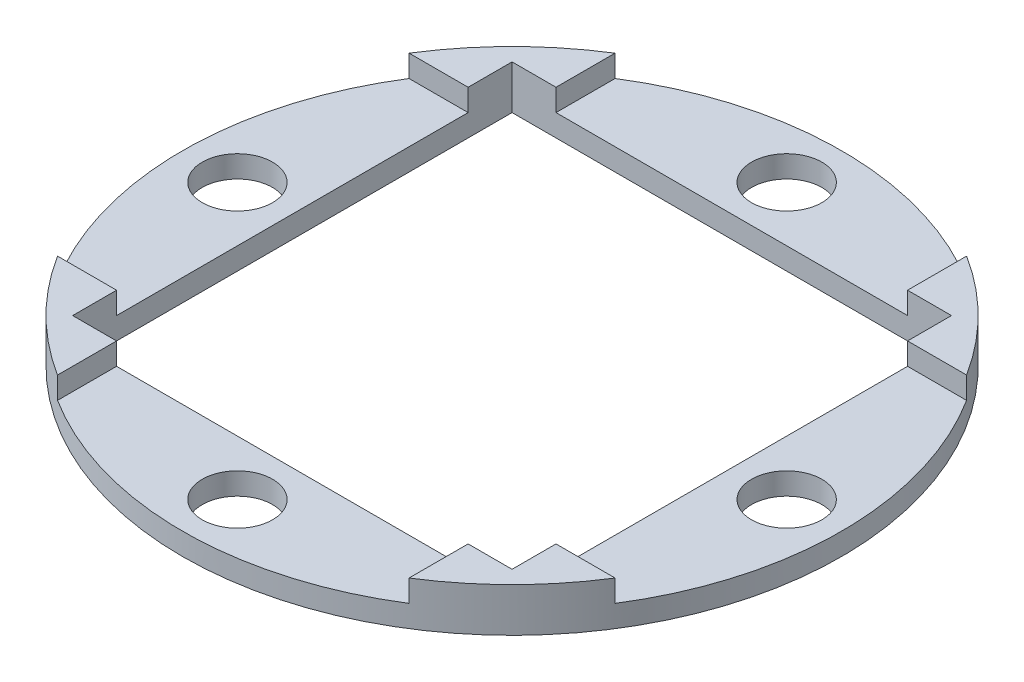
ISO-10303-21;
HEADER;
FILE_DESCRIPTION(('STEP AP214'),'2;1');
FILE_NAME('part.step','',(''),(''),'','','');
FILE_SCHEMA(('AUTOMOTIVE_DESIGN { 1 0 10303 214 1 1 1 1 }'));
ENDSEC;
DATA;
#1=APPLICATION_CONTEXT('core data for automotive mechanical design processes');
#2=APPLICATION_PROTOCOL_DEFINITION('international standard','automotive_design',2000,#1);
#3=PRODUCT_CONTEXT('',#1,'mechanical');
#4=PRODUCT('Part','Part','',(#3));
#5=PRODUCT_RELATED_PRODUCT_CATEGORY('part','',(#4));
#6=PRODUCT_DEFINITION_FORMATION('','',#4);
#7=PRODUCT_DEFINITION_CONTEXT('part definition',#1,'design');
#8=PRODUCT_DEFINITION('design','',#6,#7);
#9=PRODUCT_DEFINITION_SHAPE('','',#8);
#10=(LENGTH_UNIT() NAMED_UNIT(*) SI_UNIT(.MILLI.,.METRE.));
#11=(NAMED_UNIT(*) PLANE_ANGLE_UNIT() SI_UNIT($,.RADIAN.));
#12=(NAMED_UNIT(*) SI_UNIT($,.STERADIAN.) SOLID_ANGLE_UNIT());
#13=UNCERTAINTY_MEASURE_WITH_UNIT(LENGTH_MEASURE(1.E-05),#10,'distance_accuracy_value','');
#14=(GEOMETRIC_REPRESENTATION_CONTEXT(3) GLOBAL_UNCERTAINTY_ASSIGNED_CONTEXT((#13)) GLOBAL_UNIT_ASSIGNED_CONTEXT((#10,
#11,#12)) REPRESENTATION_CONTEXT('',''));
#15=CARTESIAN_POINT('',(0.,0.,0.));
#16=DIRECTION('',(0.,0.,1.));
#17=DIRECTION('',(1.,0.,0.));
#18=AXIS2_PLACEMENT_3D('',#15,#16,#17);
#19=CARTESIAN_POINT('',(0.,5.,0.));
#20=DIRECTION('',(0.,1.,0.));
#21=DIRECTION('',(0.,0.,1.));
#22=AXIS2_PLACEMENT_3D('',#19,#20,#21);
#23=PLANE('',#22);
#24=CARTESIAN_POINT('',(62.5,5.,0.));
#25=DIRECTION('',(0.,1.,0.));
#26=DIRECTION('',(0.,0.,1.));
#27=AXIS2_PLACEMENT_3D('',#24,#25,#26);
#28=CIRCLE('',#27,8.00000000000001);
#29=CARTESIAN_POINT('',(62.5,5.,8.00000000000001));
#30=VERTEX_POINT('',#29);
#31=EDGE_CURVE('E316',#30,#30,#28,.T.);
#32=ORIENTED_EDGE('',*,*,#31,.F.);
#33=EDGE_LOOP('',(#32));
#34=FACE_BOUND('',#33,.T.);
#35=CARTESIAN_POINT('',(0.,5.,0.));
#36=DIRECTION('',(0.,1.,0.));
#37=DIRECTION('',(0.,0.,1.));
#38=AXIS2_PLACEMENT_3D('',#35,#36,#37);
#39=CIRCLE('',#38,75.);
#40=CARTESIAN_POINT('',(63.4428877022476,5.,40.));
#41=VERTEX_POINT('',#40);
#42=CARTESIAN_POINT('',(63.4428877022476,5.,-40.));
#43=VERTEX_POINT('',#42);
#44=EDGE_CURVE('E12',#41,#43,#39,.T.);
#45=ORIENTED_EDGE('',*,*,#44,.T.);
#46=DIRECTION('',(1.,0.,0.));
#47=VECTOR('',#46,1.);
#48=CARTESIAN_POINT('',(0.,5.,-40.));
#49=LINE('',#48,#47);
#50=CARTESIAN_POINT('',(50.,5.,-40.));
#51=VERTEX_POINT('',#50);
#52=EDGE_CURVE('E450',#51,#43,#49,.T.);
#53=ORIENTED_EDGE('',*,*,#52,.F.);
#54=DIRECTION('',(0.,0.,-1.));
#55=VECTOR('',#54,1.);
#56=CARTESIAN_POINT('',(50.,5.,50.));
#57=LINE('',#56,#55);
#58=CARTESIAN_POINT('',(50.,5.,40.));
#59=VERTEX_POINT('',#58);
#60=EDGE_CURVE('E217',#59,#51,#57,.T.);
#61=ORIENTED_EDGE('',*,*,#60,.F.);
#62=DIRECTION('',(1.,0.,0.));
#63=VECTOR('',#62,1.);
#64=CARTESIAN_POINT('',(0.,5.,40.));
#65=LINE('',#64,#63);
#66=EDGE_CURVE('E284',#59,#41,#65,.T.);
#67=ORIENTED_EDGE('',*,*,#66,.T.);
#68=EDGE_LOOP('',(#45,#53,#61,#67));
#69=FACE_BOUND('',#68,.T.);
#70=ADVANCED_FACE('F51',(#34,#69),#23,.T.);
#71=DIRECTION('',(0.,0.,-1.));
#72=VECTOR('',#71,1.);
#73=CARTESIAN_POINT('',(40.,5.,0.));
#74=LINE('',#73,#72);
#75=CARTESIAN_POINT('',(40.,5.,-50.));
#76=VERTEX_POINT('',#75);
#77=CARTESIAN_POINT('',(40.,5.,-63.4428877022476));
#78=VERTEX_POINT('',#77);
#79=EDGE_CURVE('E211',#76,#78,#74,.T.);
#80=ORIENTED_EDGE('',*,*,#79,.T.);
#81=CARTESIAN_POINT('',(-40.,5.,-63.4428877022476));
#82=VERTEX_POINT('',#81);
#83=EDGE_CURVE('E60',#78,#82,#39,.T.);
#84=ORIENTED_EDGE('',*,*,#83,.T.);
#85=DIRECTION('',(0.,0.,-1.));
#86=VECTOR('',#85,1.);
#87=CARTESIAN_POINT('',(-40.,5.,0.));
#88=LINE('',#87,#86);
#89=CARTESIAN_POINT('',(-40.,5.,-50.));
#90=VERTEX_POINT('',#89);
#91=EDGE_CURVE('E218',#90,#82,#88,.T.);
#92=ORIENTED_EDGE('',*,*,#91,.F.);
#93=DIRECTION('',(1.,0.,0.));
#94=VECTOR('',#93,1.);
#95=CARTESIAN_POINT('',(-50.,5.,-50.));
#96=LINE('',#95,#94);
#97=EDGE_CURVE('E321',#90,#76,#96,.T.);
#98=ORIENTED_EDGE('',*,*,#97,.T.);
#99=EDGE_LOOP('',(#80,#84,#92,#98));
#100=FACE_BOUND('',#99,.T.);
#101=CARTESIAN_POINT('',(0.,5.,-62.5));
#102=DIRECTION('',(0.,1.,0.));
#103=DIRECTION('',(0.,0.,1.));
#104=AXIS2_PLACEMENT_3D('',#101,#102,#103);
#105=CIRCLE('',#104,8.);
#106=CARTESIAN_POINT('',(0.,5.,-54.5));
#107=VERTEX_POINT('',#106);
#108=EDGE_CURVE('E313',#107,#107,#105,.T.);
#109=ORIENTED_EDGE('',*,*,#108,.F.);
#110=EDGE_LOOP('',(#109));
#111=FACE_BOUND('',#110,.T.);
#112=ADVANCED_FACE('F381',(#100,#111),#23,.T.);
#113=DIRECTION('',(-1.,0.,0.));
#114=VECTOR('',#113,1.);
#115=CARTESIAN_POINT('',(0.,5.,-40.));
#116=LINE('',#115,#114);
#117=CARTESIAN_POINT('',(-50.,5.,-40.));
#118=VERTEX_POINT('',#117);
#119=CARTESIAN_POINT('',(-63.4428877022476,5.,-40.));
#120=VERTEX_POINT('',#119);
#121=EDGE_CURVE('E69',#118,#120,#116,.T.);
#122=ORIENTED_EDGE('',*,*,#121,.T.);
#123=CARTESIAN_POINT('',(-63.4428877022476,5.,40.));
#124=VERTEX_POINT('',#123);
#125=EDGE_CURVE('E460',#120,#124,#39,.T.);
#126=ORIENTED_EDGE('',*,*,#125,.T.);
#127=DIRECTION('',(-1.,0.,0.));
#128=VECTOR('',#127,1.);
#129=CARTESIAN_POINT('',(0.,5.,40.));
#130=LINE('',#129,#128);
#131=CARTESIAN_POINT('',(-50.,5.,40.));
#132=VERTEX_POINT('',#131);
#133=EDGE_CURVE('E256',#132,#124,#130,.T.);
#134=ORIENTED_EDGE('',*,*,#133,.F.);
#135=DIRECTION('',(0.,0.,-1.));
#136=VECTOR('',#135,1.);
#137=CARTESIAN_POINT('',(-50.,5.,50.));
#138=LINE('',#137,#136);
#139=EDGE_CURVE('E328',#132,#118,#138,.T.);
#140=ORIENTED_EDGE('',*,*,#139,.T.);
#141=EDGE_LOOP('',(#122,#126,#134,#140));
#142=FACE_BOUND('',#141,.T.);
#143=CARTESIAN_POINT('',(-62.5,5.,0.));
#144=DIRECTION('',(0.,1.,0.));
#145=DIRECTION('',(0.,0.,1.));
#146=AXIS2_PLACEMENT_3D('',#143,#144,#145);
#147=CIRCLE('',#146,8.);
#148=CARTESIAN_POINT('',(-62.5,5.,8.));
#149=VERTEX_POINT('',#148);
#150=EDGE_CURVE('E309',#149,#149,#147,.T.);
#151=ORIENTED_EDGE('',*,*,#150,.F.);
#152=EDGE_LOOP('',(#151));
#153=FACE_BOUND('',#152,.T.);
#154=ADVANCED_FACE('F388',(#142,#153),#23,.T.);
#155=DIRECTION('',(0.,0.,1.));
#156=VECTOR('',#155,1.);
#157=CARTESIAN_POINT('',(-40.,5.,0.));
#158=LINE('',#157,#156);
#159=CARTESIAN_POINT('',(-40.,5.,50.));
#160=VERTEX_POINT('',#159);
#161=CARTESIAN_POINT('',(-40.,5.,63.4428877022476));
#162=VERTEX_POINT('',#161);
#163=EDGE_CURVE('E251',#160,#162,#158,.T.);
#164=ORIENTED_EDGE('',*,*,#163,.T.);
#165=CARTESIAN_POINT('',(40.,5.,63.4428877022476));
#166=VERTEX_POINT('',#165);
#167=EDGE_CURVE('E62',#162,#166,#39,.T.);
#168=ORIENTED_EDGE('',*,*,#167,.T.);
#169=DIRECTION('',(0.,0.,1.));
#170=VECTOR('',#169,1.);
#171=CARTESIAN_POINT('',(40.,5.,0.));
#172=LINE('',#171,#170);
#173=CARTESIAN_POINT('',(40.,5.,50.));
#174=VERTEX_POINT('',#173);
#175=EDGE_CURVE('E279',#174,#166,#172,.T.);
#176=ORIENTED_EDGE('',*,*,#175,.F.);
#177=DIRECTION('',(1.,0.,0.));
#178=VECTOR('',#177,1.);
#179=CARTESIAN_POINT('',(-50.,5.,50.));
#180=LINE('',#179,#178);
#181=EDGE_CURVE('E326',#160,#174,#180,.T.);
#182=ORIENTED_EDGE('',*,*,#181,.F.);
#183=EDGE_LOOP('',(#164,#168,#176,#182));
#184=FACE_BOUND('',#183,.T.);
#185=CARTESIAN_POINT('',(0.,5.,62.5));
#186=DIRECTION('',(0.,1.,0.));
#187=DIRECTION('',(0.,0.,1.));
#188=AXIS2_PLACEMENT_3D('',#185,#186,#187);
#189=CIRCLE('',#188,8.);
#190=CARTESIAN_POINT('',(0.,5.,70.5));
#191=VERTEX_POINT('',#190);
#192=EDGE_CURVE('E308',#191,#191,#189,.T.);
#193=ORIENTED_EDGE('',*,*,#192,.F.);
#194=EDGE_LOOP('',(#193));
#195=FACE_BOUND('',#194,.T.);
#196=ADVANCED_FACE('F384',(#184,#195),#23,.T.);
#197=CARTESIAN_POINT('',(0.,5.,0.));
#198=DIRECTION('',(0.,-1.,0.));
#199=DIRECTION('',(0.,0.,-1.));
#200=AXIS2_PLACEMENT_3D('',#197,#198,#199);
#201=CYLINDRICAL_SURFACE('',#200,75.);
#202=ORIENTED_EDGE('',*,*,#44,.F.);
#203=DIRECTION('',(0.,-1.,0.));
#204=VECTOR('',#203,1.);
#205=CARTESIAN_POINT('',(63.4428877022476,10.,40.));
#206=LINE('',#205,#204);
#207=CARTESIAN_POINT('',(63.4428877022476,10.,40.));
#208=VERTEX_POINT('',#207);
#209=EDGE_CURVE('E299',#208,#41,#206,.T.);
#210=ORIENTED_EDGE('',*,*,#209,.F.);
#211=CARTESIAN_POINT('',(0.,10.,0.));
#212=DIRECTION('',(0.,1.,0.));
#213=DIRECTION('',(0.,0.,1.));
#214=AXIS2_PLACEMENT_3D('',#211,#212,#213);
#215=CIRCLE('',#214,75.);
#216=CARTESIAN_POINT('',(40.,10.,63.4428877022476));
#217=VERTEX_POINT('',#216);
#218=EDGE_CURVE('E286',#217,#208,#215,.T.);
#219=ORIENTED_EDGE('',*,*,#218,.F.);
#220=DIRECTION('',(0.,-1.,0.));
#221=VECTOR('',#220,1.);
#222=CARTESIAN_POINT('',(40.,10.,63.4428877022476));
#223=LINE('',#222,#221);
#224=EDGE_CURVE('E302',#217,#166,#223,.T.);
#225=ORIENTED_EDGE('',*,*,#224,.T.);
#226=ORIENTED_EDGE('',*,*,#167,.F.);
#227=DIRECTION('',(0.,-1.,0.));
#228=VECTOR('',#227,1.);
#229=CARTESIAN_POINT('',(-40.,10.,63.4428877022476));
#230=LINE('',#229,#228);
#231=CARTESIAN_POINT('',(-40.,10.,63.4428877022476));
#232=VERTEX_POINT('',#231);
#233=EDGE_CURVE('E265',#232,#162,#230,.T.);
#234=ORIENTED_EDGE('',*,*,#233,.F.);
#235=CARTESIAN_POINT('',(0.,10.,0.));
#236=DIRECTION('',(0.,1.,0.));
#237=DIRECTION('',(0.,0.,1.));
#238=AXIS2_PLACEMENT_3D('',#235,#236,#237);
#239=CIRCLE('',#238,75.);
#240=CARTESIAN_POINT('',(-63.4428877022476,10.,40.));
#241=VERTEX_POINT('',#240);
#242=EDGE_CURVE('E263',#241,#232,#239,.T.);
#243=ORIENTED_EDGE('',*,*,#242,.F.);
#244=DIRECTION('',(0.,-1.,0.));
#245=VECTOR('',#244,1.);
#246=CARTESIAN_POINT('',(-63.4428877022476,10.,40.));
#247=LINE('',#246,#245);
#248=EDGE_CURVE('E271',#241,#124,#247,.T.);
#249=ORIENTED_EDGE('',*,*,#248,.T.);
#250=ORIENTED_EDGE('',*,*,#125,.F.);
#251=DIRECTION('',(0.,-1.,0.));
#252=VECTOR('',#251,1.);
#253=CARTESIAN_POINT('',(-63.4428877022476,10.,-40.));
#254=LINE('',#253,#252);
#255=CARTESIAN_POINT('',(-63.4428877022476,10.,-40.));
#256=VERTEX_POINT('',#255);
#257=EDGE_CURVE('E242',#256,#120,#254,.T.);
#258=ORIENTED_EDGE('',*,*,#257,.F.);
#259=CARTESIAN_POINT('',(0.,10.,0.));
#260=DIRECTION('',(0.,1.,0.));
#261=DIRECTION('',(0.,0.,1.));
#262=AXIS2_PLACEMENT_3D('',#259,#260,#261);
#263=CIRCLE('',#262,75.);
#264=CARTESIAN_POINT('',(-40.,10.,-63.4428877022476));
#265=VERTEX_POINT('',#264);
#266=EDGE_CURVE('E230',#265,#256,#263,.T.);
#267=ORIENTED_EDGE('',*,*,#266,.F.);
#268=DIRECTION('',(0.,-1.,0.));
#269=VECTOR('',#268,1.);
#270=CARTESIAN_POINT('',(-40.,10.,-63.4428877022476));
#271=LINE('',#270,#269);
#272=EDGE_CURVE('E245',#265,#82,#271,.T.);
#273=ORIENTED_EDGE('',*,*,#272,.T.);
#274=ORIENTED_EDGE('',*,*,#83,.F.);
#275=DIRECTION('',(0.,-1.,0.));
#276=VECTOR('',#275,1.);
#277=CARTESIAN_POINT('',(40.,10.,-63.4428877022476));
#278=LINE('',#277,#276);
#279=CARTESIAN_POINT('',(40.,10.,-63.4428877022476));
#280=VERTEX_POINT('',#279);
#281=EDGE_CURVE('E221',#280,#78,#278,.T.);
#282=ORIENTED_EDGE('',*,*,#281,.F.);
#283=CARTESIAN_POINT('',(0.,10.,0.));
#284=DIRECTION('',(0.,1.,0.));
#285=DIRECTION('',(0.,0.,1.));
#286=AXIS2_PLACEMENT_3D('',#283,#284,#285);
#287=CIRCLE('',#286,75.);
#288=CARTESIAN_POINT('',(63.4428877022476,10.,-40.));
#289=VERTEX_POINT('',#288);
#290=EDGE_CURVE('E200',#289,#280,#287,.T.);
#291=ORIENTED_EDGE('',*,*,#290,.F.);
#292=DIRECTION('',(0.,-1.,0.));
#293=VECTOR('',#292,1.);
#294=CARTESIAN_POINT('',(63.4428877022476,10.,-40.));
#295=LINE('',#294,#293);
#296=EDGE_CURVE('E197',#289,#43,#295,.T.);
#297=ORIENTED_EDGE('',*,*,#296,.T.);
#298=EDGE_LOOP('',(#202,#210,#219,#225,#226,#234,#243,#249,#250,#258,#267,#273,#274,#282,#291,#297));
#299=FACE_BOUND('',#298,.T.);
#300=CARTESIAN_POINT('',(0.,0.,0.));
#301=DIRECTION('',(0.,1.,0.));
#302=DIRECTION('',(0.,0.,1.));
#303=AXIS2_PLACEMENT_3D('',#300,#301,#302);
#304=CIRCLE('',#303,75.);
#305=CARTESIAN_POINT('',(0.,0.,75.));
#306=VERTEX_POINT('',#305);
#307=EDGE_CURVE('E343',#306,#306,#304,.T.);
#308=ORIENTED_EDGE('',*,*,#307,.T.);
#309=EDGE_LOOP('',(#308));
#310=FACE_BOUND('',#309,.T.);
#311=ADVANCED_FACE('F53',(#299,#310),#201,.T.);
#312=CARTESIAN_POINT('',(0.,0.,0.));
#313=DIRECTION('',(0.,1.,0.));
#314=DIRECTION('',(0.,0.,1.));
#315=AXIS2_PLACEMENT_3D('',#312,#313,#314);
#316=PLANE('',#315);
#317=CARTESIAN_POINT('',(-62.5,0.,0.));
#318=DIRECTION('',(0.,1.,0.));
#319=DIRECTION('',(0.,0.,1.));
#320=AXIS2_PLACEMENT_3D('',#317,#318,#319);
#321=CIRCLE('',#320,8.);
#322=CARTESIAN_POINT('',(-62.5,0.,8.));
#323=VERTEX_POINT('',#322);
#324=EDGE_CURVE('E55',#323,#323,#321,.T.);
#325=ORIENTED_EDGE('',*,*,#324,.T.);
#326=EDGE_LOOP('',(#325));
#327=FACE_BOUND('',#326,.T.);
#328=CARTESIAN_POINT('',(0.,0.,-62.5));
#329=DIRECTION('',(0.,1.,0.));
#330=DIRECTION('',(0.,0.,1.));
#331=AXIS2_PLACEMENT_3D('',#328,#329,#330);
#332=CIRCLE('',#331,8.);
#333=CARTESIAN_POINT('',(0.,0.,-54.5));
#334=VERTEX_POINT('',#333);
#335=EDGE_CURVE('E355',#334,#334,#332,.T.);
#336=ORIENTED_EDGE('',*,*,#335,.T.);
#337=EDGE_LOOP('',(#336));
#338=FACE_BOUND('',#337,.T.);
#339=CARTESIAN_POINT('',(62.5,0.,0.));
#340=DIRECTION('',(0.,1.,0.));
#341=DIRECTION('',(0.,0.,1.));
#342=AXIS2_PLACEMENT_3D('',#339,#340,#341);
#343=CIRCLE('',#342,8.00000000000001);
#344=CARTESIAN_POINT('',(62.5,0.,8.00000000000001));
#345=VERTEX_POINT('',#344);
#346=EDGE_CURVE('E353',#345,#345,#343,.T.);
#347=ORIENTED_EDGE('',*,*,#346,.T.);
#348=EDGE_LOOP('',(#347));
#349=FACE_BOUND('',#348,.T.);
#350=CARTESIAN_POINT('',(0.,0.,62.5));
#351=DIRECTION('',(0.,1.,0.));
#352=DIRECTION('',(0.,0.,1.));
#353=AXIS2_PLACEMENT_3D('',#350,#351,#352);
#354=CIRCLE('',#353,8.);
#355=CARTESIAN_POINT('',(0.,0.,70.5));
#356=VERTEX_POINT('',#355);
#357=EDGE_CURVE('E312',#356,#356,#354,.T.);
#358=ORIENTED_EDGE('',*,*,#357,.T.);
#359=EDGE_LOOP('',(#358));
#360=FACE_BOUND('',#359,.T.);
#361=DIRECTION('',(0.,0.,-1.));
#362=VECTOR('',#361,1.);
#363=CARTESIAN_POINT('',(50.,0.,50.));
#364=LINE('',#363,#362);
#365=CARTESIAN_POINT('',(50.,0.,50.));
#366=VERTEX_POINT('',#365);
#367=CARTESIAN_POINT('',(50.,0.,-50.));
#368=VERTEX_POINT('',#367);
#369=EDGE_CURVE('E333',#366,#368,#364,.T.);
#370=ORIENTED_EDGE('',*,*,#369,.T.);
#371=DIRECTION('',(1.,0.,0.));
#372=VECTOR('',#371,1.);
#373=CARTESIAN_POINT('',(-50.,0.,-50.));
#374=LINE('',#373,#372);
#375=CARTESIAN_POINT('',(-50.,0.,-50.));
#376=VERTEX_POINT('',#375);
#377=EDGE_CURVE('E331',#376,#368,#374,.T.);
#378=ORIENTED_EDGE('',*,*,#377,.F.);
#379=DIRECTION('',(0.,0.,-1.));
#380=VECTOR('',#379,1.);
#381=CARTESIAN_POINT('',(-50.,0.,50.));
#382=LINE('',#381,#380);
#383=CARTESIAN_POINT('',(-50.,0.,50.));
#384=VERTEX_POINT('',#383);
#385=EDGE_CURVE('E324',#384,#376,#382,.T.);
#386=ORIENTED_EDGE('',*,*,#385,.F.);
#387=DIRECTION('',(1.,0.,0.));
#388=VECTOR('',#387,1.);
#389=CARTESIAN_POINT('',(-50.,0.,50.));
#390=LINE('',#389,#388);
#391=EDGE_CURVE('E336',#384,#366,#390,.T.);
#392=ORIENTED_EDGE('',*,*,#391,.T.);
#393=EDGE_LOOP('',(#370,#378,#386,#392));
#394=FACE_BOUND('',#393,.T.);
#395=ORIENTED_EDGE('',*,*,#307,.F.);
#396=EDGE_LOOP('',(#395));
#397=FACE_BOUND('',#396,.T.);
#398=ADVANCED_FACE('F362',(#327,#338,#349,#360,#394,#397),#316,.F.);
#399=CARTESIAN_POINT('',(-50.,5.,-50.));
#400=DIRECTION('',(0.,0.,-1.));
#401=DIRECTION('',(-1.,0.,0.));
#402=AXIS2_PLACEMENT_3D('',#399,#400,#401);
#403=PLANE('',#402);
#404=ORIENTED_EDGE('',*,*,#377,.T.);
#405=DIRECTION('',(0.,-1.,0.));
#406=VECTOR('',#405,1.);
#407=CARTESIAN_POINT('',(50.,5.,-50.));
#408=LINE('',#407,#406);
#409=CARTESIAN_POINT('',(50.,10.,-50.));
#410=VERTEX_POINT('',#409);
#411=EDGE_CURVE('E330',#410,#368,#408,.T.);
#412=ORIENTED_EDGE('',*,*,#411,.F.);
#413=DIRECTION('',(1.,0.,0.));
#414=VECTOR('',#413,1.);
#415=CARTESIAN_POINT('',(0.,10.,-50.));
#416=LINE('',#415,#414);
#417=CARTESIAN_POINT('',(40.,10.,-50.));
#418=VERTEX_POINT('',#417);
#419=EDGE_CURVE('E208',#418,#410,#416,.T.);
#420=ORIENTED_EDGE('',*,*,#419,.F.);
#421=DIRECTION('',(0.,-1.,0.));
#422=VECTOR('',#421,1.);
#423=CARTESIAN_POINT('',(40.,10.,-50.));
#424=LINE('',#423,#422);
#425=EDGE_CURVE('E449',#418,#76,#424,.T.);
#426=ORIENTED_EDGE('',*,*,#425,.T.);
#427=ORIENTED_EDGE('',*,*,#97,.F.);
#428=DIRECTION('',(0.,-1.,0.));
#429=VECTOR('',#428,1.);
#430=CARTESIAN_POINT('',(-40.,10.,-50.));
#431=LINE('',#430,#429);
#432=CARTESIAN_POINT('',(-40.,10.,-50.));
#433=VERTEX_POINT('',#432);
#434=EDGE_CURVE('E248',#433,#90,#431,.T.);
#435=ORIENTED_EDGE('',*,*,#434,.F.);
#436=DIRECTION('',(1.,0.,0.));
#437=VECTOR('',#436,1.);
#438=CARTESIAN_POINT('',(0.,10.,-50.));
#439=LINE('',#438,#437);
#440=CARTESIAN_POINT('',(-50.,10.,-50.));
#441=VERTEX_POINT('',#440);
#442=EDGE_CURVE('E225',#441,#433,#439,.T.);
#443=ORIENTED_EDGE('',*,*,#442,.F.);
#444=DIRECTION('',(0.,-1.,0.));
#445=VECTOR('',#444,1.);
#446=CARTESIAN_POINT('',(-50.,5.,-50.));
#447=LINE('',#446,#445);
#448=EDGE_CURVE('E341',#441,#376,#447,.T.);
#449=ORIENTED_EDGE('',*,*,#448,.T.);
#450=EDGE_LOOP('',(#404,#412,#420,#426,#427,#435,#443,#449));
#451=FACE_BOUND('',#450,.T.);
#452=ADVANCED_FACE('F412',(#451),#403,.F.);
#453=CARTESIAN_POINT('',(-50.,5.,50.));
#454=DIRECTION('',(-1.,0.,0.));
#455=DIRECTION('',(0.,0.,1.));
#456=AXIS2_PLACEMENT_3D('',#453,#454,#455);
#457=PLANE('',#456);
#458=ORIENTED_EDGE('',*,*,#385,.T.);
#459=ORIENTED_EDGE('',*,*,#448,.F.);
#460=DIRECTION('',(0.,0.,-1.));
#461=VECTOR('',#460,1.);
#462=CARTESIAN_POINT('',(-50.,10.,0.));
#463=LINE('',#462,#461);
#464=CARTESIAN_POINT('',(-50.,10.,-40.));
#465=VERTEX_POINT('',#464);
#466=EDGE_CURVE('E235',#465,#441,#463,.T.);
#467=ORIENTED_EDGE('',*,*,#466,.F.);
#468=DIRECTION('',(0.,-1.,0.));
#469=VECTOR('',#468,1.);
#470=CARTESIAN_POINT('',(-50.,10.,-40.));
#471=LINE('',#470,#469);
#472=EDGE_CURVE('E237',#465,#118,#471,.T.);
#473=ORIENTED_EDGE('',*,*,#472,.T.);
#474=ORIENTED_EDGE('',*,*,#139,.F.);
#475=DIRECTION('',(0.,-1.,0.));
#476=VECTOR('',#475,1.);
#477=CARTESIAN_POINT('',(-50.,10.,40.));
#478=LINE('',#477,#476);
#479=CARTESIAN_POINT('',(-50.,10.,40.));
#480=VERTEX_POINT('',#479);
#481=EDGE_CURVE('E274',#480,#132,#478,.T.);
#482=ORIENTED_EDGE('',*,*,#481,.F.);
#483=DIRECTION('',(0.,0.,-1.));
#484=VECTOR('',#483,1.);
#485=CARTESIAN_POINT('',(-50.,10.,0.));
#486=LINE('',#485,#484);
#487=CARTESIAN_POINT('',(-50.,10.,50.));
#488=VERTEX_POINT('',#487);
#489=EDGE_CURVE('E259',#488,#480,#486,.T.);
#490=ORIENTED_EDGE('',*,*,#489,.F.);
#491=DIRECTION('',(0.,-1.,0.));
#492=VECTOR('',#491,1.);
#493=CARTESIAN_POINT('',(-50.,5.,50.));
#494=LINE('',#493,#492);
#495=EDGE_CURVE('E344',#488,#384,#494,.T.);
#496=ORIENTED_EDGE('',*,*,#495,.T.);
#497=EDGE_LOOP('',(#458,#459,#467,#473,#474,#482,#490,#496));
#498=FACE_BOUND('',#497,.T.);
#499=ADVANCED_FACE('F425',(#498),#457,.F.);
#500=CARTESIAN_POINT('',(-50.,5.,50.));
#501=DIRECTION('',(0.,0.,-1.));
#502=DIRECTION('',(-1.,0.,0.));
#503=AXIS2_PLACEMENT_3D('',#500,#501,#502);
#504=PLANE('',#503);
#505=ORIENTED_EDGE('',*,*,#391,.F.);
#506=ORIENTED_EDGE('',*,*,#495,.F.);
#507=DIRECTION('',(-1.,0.,0.));
#508=VECTOR('',#507,1.);
#509=CARTESIAN_POINT('',(0.,10.,50.));
#510=LINE('',#509,#508);
#511=CARTESIAN_POINT('',(-40.,10.,50.));
#512=VERTEX_POINT('',#511);
#513=EDGE_CURVE('E255',#512,#488,#510,.T.);
#514=ORIENTED_EDGE('',*,*,#513,.F.);
#515=DIRECTION('',(0.,-1.,0.));
#516=VECTOR('',#515,1.);
#517=CARTESIAN_POINT('',(-40.,10.,50.));
#518=LINE('',#517,#516);
#519=EDGE_CURVE('E276',#512,#160,#518,.T.);
#520=ORIENTED_EDGE('',*,*,#519,.T.);
#521=ORIENTED_EDGE('',*,*,#181,.T.);
#522=DIRECTION('',(0.,-1.,0.));
#523=VECTOR('',#522,1.);
#524=CARTESIAN_POINT('',(40.,10.,50.));
#525=LINE('',#524,#523);
#526=CARTESIAN_POINT('',(40.,10.,50.));
#527=VERTEX_POINT('',#526);
#528=EDGE_CURVE('E305',#527,#174,#525,.T.);
#529=ORIENTED_EDGE('',*,*,#528,.F.);
#530=DIRECTION('',(-1.,0.,0.));
#531=VECTOR('',#530,1.);
#532=CARTESIAN_POINT('',(0.,10.,50.));
#533=LINE('',#532,#531);
#534=CARTESIAN_POINT('',(50.,10.,50.));
#535=VERTEX_POINT('',#534);
#536=EDGE_CURVE('E280',#535,#527,#533,.T.);
#537=ORIENTED_EDGE('',*,*,#536,.F.);
#538=DIRECTION('',(0.,-1.,0.));
#539=VECTOR('',#538,1.);
#540=CARTESIAN_POINT('',(50.,5.,50.));
#541=LINE('',#540,#539);
#542=EDGE_CURVE('E346',#535,#366,#541,.T.);
#543=ORIENTED_EDGE('',*,*,#542,.T.);
#544=EDGE_LOOP('',(#505,#506,#514,#520,#521,#529,#537,#543));
#545=FACE_BOUND('',#544,.T.);
#546=ADVANCED_FACE('F430',(#545),#504,.T.);
#547=CARTESIAN_POINT('',(50.,5.,50.));
#548=DIRECTION('',(-1.,0.,0.));
#549=DIRECTION('',(0.,0.,1.));
#550=AXIS2_PLACEMENT_3D('',#547,#548,#549);
#551=PLANE('',#550);
#552=ORIENTED_EDGE('',*,*,#369,.F.);
#553=ORIENTED_EDGE('',*,*,#542,.F.);
#554=DIRECTION('',(0.,0.,1.));
#555=VECTOR('',#554,1.);
#556=CARTESIAN_POINT('',(50.,10.,0.));
#557=LINE('',#556,#555);
#558=CARTESIAN_POINT('',(50.,10.,40.));
#559=VERTEX_POINT('',#558);
#560=EDGE_CURVE('E291',#559,#535,#557,.T.);
#561=ORIENTED_EDGE('',*,*,#560,.F.);
#562=DIRECTION('',(0.,-1.,0.));
#563=VECTOR('',#562,1.);
#564=CARTESIAN_POINT('',(50.,10.,40.));
#565=LINE('',#564,#563);
#566=EDGE_CURVE('E294',#559,#59,#565,.T.);
#567=ORIENTED_EDGE('',*,*,#566,.T.);
#568=ORIENTED_EDGE('',*,*,#60,.T.);
#569=DIRECTION('',(0.,-1.,0.));
#570=VECTOR('',#569,1.);
#571=CARTESIAN_POINT('',(50.,10.,-40.));
#572=LINE('',#571,#570);
#573=CARTESIAN_POINT('',(50.,10.,-40.));
#574=VERTEX_POINT('',#573);
#575=EDGE_CURVE('E194',#574,#51,#572,.T.);
#576=ORIENTED_EDGE('',*,*,#575,.F.);
#577=DIRECTION('',(0.,0.,1.));
#578=VECTOR('',#577,1.);
#579=CARTESIAN_POINT('',(50.,10.,0.));
#580=LINE('',#579,#578);
#581=EDGE_CURVE('E201',#410,#574,#580,.T.);
#582=ORIENTED_EDGE('',*,*,#581,.F.);
#583=ORIENTED_EDGE('',*,*,#411,.T.);
#584=EDGE_LOOP('',(#552,#553,#561,#567,#568,#576,#582,#583));
#585=FACE_BOUND('',#584,.T.);
#586=ADVANCED_FACE('F215',(#585),#551,.T.);
#587=CARTESIAN_POINT('',(0.,-5.,62.5));
#588=DIRECTION('',(0.,1.,0.));
#589=DIRECTION('',(0.,0.,1.));
#590=AXIS2_PLACEMENT_3D('',#587,#588,#589);
#591=CYLINDRICAL_SURFACE('',#590,8.);
#592=ORIENTED_EDGE('',*,*,#192,.T.);
#593=EDGE_LOOP('',(#592));
#594=FACE_BOUND('',#593,.T.);
#595=ORIENTED_EDGE('',*,*,#357,.F.);
#596=EDGE_LOOP('',(#595));
#597=FACE_BOUND('',#596,.T.);
#598=ADVANCED_FACE('F404',(#594,#597),#591,.F.);
#599=CARTESIAN_POINT('',(62.5,-5.,0.));
#600=DIRECTION('',(0.,1.,0.));
#601=DIRECTION('',(0.,0.,1.));
#602=AXIS2_PLACEMENT_3D('',#599,#600,#601);
#603=CYLINDRICAL_SURFACE('',#602,8.00000000000001);
#604=ORIENTED_EDGE('',*,*,#31,.T.);
#605=EDGE_LOOP('',(#604));
#606=FACE_BOUND('',#605,.T.);
#607=ORIENTED_EDGE('',*,*,#346,.F.);
#608=EDGE_LOOP('',(#607));
#609=FACE_BOUND('',#608,.T.);
#610=ADVANCED_FACE('F377',(#606,#609),#603,.F.);
#611=CARTESIAN_POINT('',(0.,-5.,-62.5));
#612=DIRECTION('',(0.,1.,0.));
#613=DIRECTION('',(0.,0.,1.));
#614=AXIS2_PLACEMENT_3D('',#611,#612,#613);
#615=CYLINDRICAL_SURFACE('',#614,8.);
#616=ORIENTED_EDGE('',*,*,#108,.T.);
#617=EDGE_LOOP('',(#616));
#618=FACE_BOUND('',#617,.T.);
#619=ORIENTED_EDGE('',*,*,#335,.F.);
#620=EDGE_LOOP('',(#619));
#621=FACE_BOUND('',#620,.T.);
#622=ADVANCED_FACE('F367',(#618,#621),#615,.F.);
#623=CARTESIAN_POINT('',(-62.5,-5.,0.));
#624=DIRECTION('',(0.,1.,0.));
#625=DIRECTION('',(0.,0.,1.));
#626=AXIS2_PLACEMENT_3D('',#623,#624,#625);
#627=CYLINDRICAL_SURFACE('',#626,8.);
#628=ORIENTED_EDGE('',*,*,#150,.T.);
#629=EDGE_LOOP('',(#628));
#630=FACE_BOUND('',#629,.T.);
#631=ORIENTED_EDGE('',*,*,#324,.F.);
#632=EDGE_LOOP('',(#631));
#633=FACE_BOUND('',#632,.T.);
#634=ADVANCED_FACE('F364',(#630,#633),#627,.F.);
#635=CARTESIAN_POINT('',(40.,10.,0.));
#636=DIRECTION('',(1.,0.,0.));
#637=DIRECTION('',(0.,0.,-1.));
#638=AXIS2_PLACEMENT_3D('',#635,#636,#637);
#639=PLANE('',#638);
#640=ORIENTED_EDGE('',*,*,#175,.T.);
#641=ORIENTED_EDGE('',*,*,#224,.F.);
#642=DIRECTION('',(0.,0.,1.));
#643=VECTOR('',#642,1.);
#644=CARTESIAN_POINT('',(40.,10.,0.));
#645=LINE('',#644,#643);
#646=EDGE_CURVE('E283',#527,#217,#645,.T.);
#647=ORIENTED_EDGE('',*,*,#646,.F.);
#648=ORIENTED_EDGE('',*,*,#528,.T.);
#649=EDGE_LOOP('',(#640,#641,#647,#648));
#650=FACE_BOUND('',#649,.T.);
#651=ADVANCED_FACE('F366',(#650),#639,.F.);
#652=CARTESIAN_POINT('',(0.,10.,40.));
#653=DIRECTION('',(0.,0.,-1.));
#654=DIRECTION('',(-1.,0.,0.));
#655=AXIS2_PLACEMENT_3D('',#652,#653,#654);
#656=PLANE('',#655);
#657=ORIENTED_EDGE('',*,*,#66,.F.);
#658=ORIENTED_EDGE('',*,*,#566,.F.);
#659=DIRECTION('',(1.,0.,0.));
#660=VECTOR('',#659,1.);
#661=CARTESIAN_POINT('',(0.,10.,40.));
#662=LINE('',#661,#660);
#663=EDGE_CURVE('E288',#559,#208,#662,.T.);
#664=ORIENTED_EDGE('',*,*,#663,.T.);
#665=ORIENTED_EDGE('',*,*,#209,.T.);
#666=EDGE_LOOP('',(#657,#658,#664,#665));
#667=FACE_BOUND('',#666,.T.);
#668=ADVANCED_FACE('F374',(#667),#656,.T.);
#669=CARTESIAN_POINT('',(0.,10.,0.));
#670=DIRECTION('',(0.,1.,0.));
#671=DIRECTION('',(0.,0.,1.));
#672=AXIS2_PLACEMENT_3D('',#669,#670,#671);
#673=PLANE('',#672);
#674=ORIENTED_EDGE('',*,*,#536,.T.);
#675=ORIENTED_EDGE('',*,*,#646,.T.);
#676=ORIENTED_EDGE('',*,*,#218,.T.);
#677=ORIENTED_EDGE('',*,*,#663,.F.);
#678=ORIENTED_EDGE('',*,*,#560,.T.);
#679=EDGE_LOOP('',(#674,#675,#676,#677,#678));
#680=FACE_BOUND('',#679,.T.);
#681=ADVANCED_FACE('F434',(#680),#673,.T.);
#682=CARTESIAN_POINT('',(-40.,10.,0.));
#683=DIRECTION('',(1.,0.,0.));
#684=DIRECTION('',(0.,0.,-1.));
#685=AXIS2_PLACEMENT_3D('',#682,#683,#684);
#686=PLANE('',#685);
#687=ORIENTED_EDGE('',*,*,#163,.F.);
#688=ORIENTED_EDGE('',*,*,#519,.F.);
#689=DIRECTION('',(0.,0.,1.));
#690=VECTOR('',#689,1.);
#691=CARTESIAN_POINT('',(-40.,10.,0.));
#692=LINE('',#691,#690);
#693=EDGE_CURVE('E252',#512,#232,#692,.T.);
#694=ORIENTED_EDGE('',*,*,#693,.T.);
#695=ORIENTED_EDGE('',*,*,#233,.T.);
#696=EDGE_LOOP('',(#687,#688,#694,#695));
#697=FACE_BOUND('',#696,.T.);
#698=ADVANCED_FACE('F467',(#697),#686,.T.);
#699=CARTESIAN_POINT('',(0.,10.,40.));
#700=DIRECTION('',(0.,0.,1.));
#701=DIRECTION('',(1.,0.,0.));
#702=AXIS2_PLACEMENT_3D('',#699,#700,#701);
#703=PLANE('',#702);
#704=ORIENTED_EDGE('',*,*,#133,.T.);
#705=ORIENTED_EDGE('',*,*,#248,.F.);
#706=DIRECTION('',(-1.,0.,0.));
#707=VECTOR('',#706,1.);
#708=CARTESIAN_POINT('',(0.,10.,40.));
#709=LINE('',#708,#707);
#710=EDGE_CURVE('E261',#480,#241,#709,.T.);
#711=ORIENTED_EDGE('',*,*,#710,.F.);
#712=ORIENTED_EDGE('',*,*,#481,.T.);
#713=EDGE_LOOP('',(#704,#705,#711,#712));
#714=FACE_BOUND('',#713,.T.);
#715=ADVANCED_FACE('F473',(#714),#703,.F.);
#716=CARTESIAN_POINT('',(0.,10.,0.));
#717=DIRECTION('',(0.,1.,0.));
#718=DIRECTION('',(0.,0.,1.));
#719=AXIS2_PLACEMENT_3D('',#716,#717,#718);
#720=PLANE('',#719);
#721=ORIENTED_EDGE('',*,*,#693,.F.);
#722=ORIENTED_EDGE('',*,*,#513,.T.);
#723=ORIENTED_EDGE('',*,*,#489,.T.);
#724=ORIENTED_EDGE('',*,*,#710,.T.);
#725=ORIENTED_EDGE('',*,*,#242,.T.);
#726=EDGE_LOOP('',(#721,#722,#723,#724,#725));
#727=FACE_BOUND('',#726,.T.);
#728=ADVANCED_FACE('F469',(#727),#720,.T.);
#729=CARTESIAN_POINT('',(-40.,10.,0.));
#730=DIRECTION('',(-1.,0.,0.));
#731=DIRECTION('',(0.,0.,1.));
#732=AXIS2_PLACEMENT_3D('',#729,#730,#731);
#733=PLANE('',#732);
#734=ORIENTED_EDGE('',*,*,#91,.T.);
#735=ORIENTED_EDGE('',*,*,#272,.F.);
#736=DIRECTION('',(0.,0.,-1.));
#737=VECTOR('',#736,1.);
#738=CARTESIAN_POINT('',(-40.,10.,0.));
#739=LINE('',#738,#737);
#740=EDGE_CURVE('E228',#433,#265,#739,.T.);
#741=ORIENTED_EDGE('',*,*,#740,.F.);
#742=ORIENTED_EDGE('',*,*,#434,.T.);
#743=EDGE_LOOP('',(#734,#735,#741,#742));
#744=FACE_BOUND('',#743,.T.);
#745=ADVANCED_FACE('F481',(#744),#733,.F.);
#746=CARTESIAN_POINT('',(0.,10.,-40.));
#747=DIRECTION('',(0.,0.,1.));
#748=DIRECTION('',(1.,0.,0.));
#749=AXIS2_PLACEMENT_3D('',#746,#747,#748);
#750=PLANE('',#749);
#751=ORIENTED_EDGE('',*,*,#121,.F.);
#752=ORIENTED_EDGE('',*,*,#472,.F.);
#753=DIRECTION('',(-1.,0.,0.));
#754=VECTOR('',#753,1.);
#755=CARTESIAN_POINT('',(0.,10.,-40.));
#756=LINE('',#755,#754);
#757=EDGE_CURVE('E232',#465,#256,#756,.T.);
#758=ORIENTED_EDGE('',*,*,#757,.T.);
#759=ORIENTED_EDGE('',*,*,#257,.T.);
#760=EDGE_LOOP('',(#751,#752,#758,#759));
#761=FACE_BOUND('',#760,.T.);
#762=ADVANCED_FACE('F476',(#761),#750,.T.);
#763=CARTESIAN_POINT('',(0.,10.,0.));
#764=DIRECTION('',(0.,1.,0.));
#765=DIRECTION('',(0.,0.,1.));
#766=AXIS2_PLACEMENT_3D('',#763,#764,#765);
#767=PLANE('',#766);
#768=ORIENTED_EDGE('',*,*,#442,.T.);
#769=ORIENTED_EDGE('',*,*,#740,.T.);
#770=ORIENTED_EDGE('',*,*,#266,.T.);
#771=ORIENTED_EDGE('',*,*,#757,.F.);
#772=ORIENTED_EDGE('',*,*,#466,.T.);
#773=EDGE_LOOP('',(#768,#769,#770,#771,#772));
#774=FACE_BOUND('',#773,.T.);
#775=ADVANCED_FACE('F479',(#774),#767,.T.);
#776=CARTESIAN_POINT('',(0.,10.,-40.));
#777=DIRECTION('',(0.,0.,-1.));
#778=DIRECTION('',(-1.,0.,0.));
#779=AXIS2_PLACEMENT_3D('',#776,#777,#778);
#780=PLANE('',#779);
#781=ORIENTED_EDGE('',*,*,#52,.T.);
#782=ORIENTED_EDGE('',*,*,#296,.F.);
#783=DIRECTION('',(1.,0.,0.));
#784=VECTOR('',#783,1.);
#785=CARTESIAN_POINT('',(0.,10.,-40.));
#786=LINE('',#785,#784);
#787=EDGE_CURVE('E190',#574,#289,#786,.T.);
#788=ORIENTED_EDGE('',*,*,#787,.F.);
#789=ORIENTED_EDGE('',*,*,#575,.T.);
#790=EDGE_LOOP('',(#781,#782,#788,#789));
#791=FACE_BOUND('',#790,.T.);
#792=ADVANCED_FACE('F192',(#791),#780,.F.);
#793=CARTESIAN_POINT('',(40.,10.,0.));
#794=DIRECTION('',(-1.,0.,0.));
#795=DIRECTION('',(0.,0.,1.));
#796=AXIS2_PLACEMENT_3D('',#793,#794,#795);
#797=PLANE('',#796);
#798=ORIENTED_EDGE('',*,*,#79,.F.);
#799=ORIENTED_EDGE('',*,*,#425,.F.);
#800=DIRECTION('',(0.,0.,-1.));
#801=VECTOR('',#800,1.);
#802=CARTESIAN_POINT('',(40.,10.,0.));
#803=LINE('',#802,#801);
#804=EDGE_CURVE('E444',#418,#280,#803,.T.);
#805=ORIENTED_EDGE('',*,*,#804,.T.);
#806=ORIENTED_EDGE('',*,*,#281,.T.);
#807=EDGE_LOOP('',(#798,#799,#805,#806));
#808=FACE_BOUND('',#807,.T.);
#809=ADVANCED_FACE('F455',(#808),#797,.T.);
#810=CARTESIAN_POINT('',(0.,10.,0.));
#811=DIRECTION('',(0.,1.,0.));
#812=DIRECTION('',(0.,0.,1.));
#813=AXIS2_PLACEMENT_3D('',#810,#811,#812);
#814=PLANE('',#813);
#815=ORIENTED_EDGE('',*,*,#581,.T.);
#816=ORIENTED_EDGE('',*,*,#787,.T.);
#817=ORIENTED_EDGE('',*,*,#290,.T.);
#818=ORIENTED_EDGE('',*,*,#804,.F.);
#819=ORIENTED_EDGE('',*,*,#419,.T.);
#820=EDGE_LOOP('',(#815,#816,#817,#818,#819));
#821=FACE_BOUND('',#820,.T.);
#822=ADVANCED_FACE('F205',(#821),#814,.T.);
#823=CLOSED_SHELL('',(#70,#112,#154,#196,#311,#398,#452,#499,#546,#586,#598,#610,#622,#634,#651,
#668,#681,#698,#715,#728,#745,#762,#775,#792,#809,#822));
#824=MANIFOLD_SOLID_BREP('B2',#823);
#825=ADVANCED_BREP_SHAPE_REPRESENTATION('',(#18,#824),#14);
#826=SHAPE_DEFINITION_REPRESENTATION(#9,#825);
ENDSEC;
END-ISO-10303-21;
